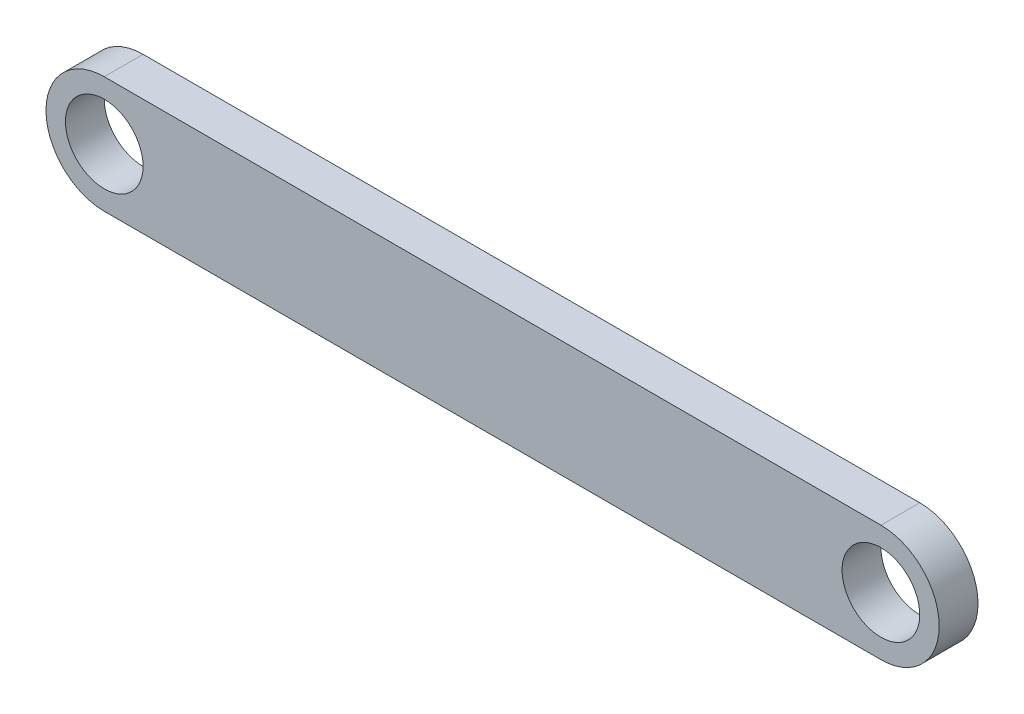
ISO-10303-21;
HEADER;
FILE_DESCRIPTION(('STEP AP214'),'2;1');
FILE_NAME('part.step','',(''),(''),'','','');
FILE_SCHEMA(('AUTOMOTIVE_DESIGN { 1 0 10303 214 1 1 1 1 }'));
ENDSEC;
DATA;
#1=APPLICATION_CONTEXT('core data for automotive mechanical design processes');
#2=APPLICATION_PROTOCOL_DEFINITION('international standard','automotive_design',2000,#1);
#3=PRODUCT_CONTEXT('',#1,'mechanical');
#4=PRODUCT('Part','Part','',(#3));
#5=PRODUCT_RELATED_PRODUCT_CATEGORY('part','',(#4));
#6=PRODUCT_DEFINITION_FORMATION('','',#4);
#7=PRODUCT_DEFINITION_CONTEXT('part definition',#1,'design');
#8=PRODUCT_DEFINITION('design','',#6,#7);
#9=PRODUCT_DEFINITION_SHAPE('','',#8);
#10=(LENGTH_UNIT() NAMED_UNIT(*) SI_UNIT(.MILLI.,.METRE.));
#11=(NAMED_UNIT(*) PLANE_ANGLE_UNIT() SI_UNIT($,.RADIAN.));
#12=(NAMED_UNIT(*) SI_UNIT($,.STERADIAN.) SOLID_ANGLE_UNIT());
#13=UNCERTAINTY_MEASURE_WITH_UNIT(LENGTH_MEASURE(1.E-05),#10,'distance_accuracy_value','');
#14=(GEOMETRIC_REPRESENTATION_CONTEXT(3) GLOBAL_UNCERTAINTY_ASSIGNED_CONTEXT((#13)) GLOBAL_UNIT_ASSIGNED_CONTEXT((#10,
#11,#12)) REPRESENTATION_CONTEXT('',''));
#15=CARTESIAN_POINT('',(0.,0.,0.));
#16=DIRECTION('',(0.,0.,1.));
#17=DIRECTION('',(1.,0.,0.));
#18=AXIS2_PLACEMENT_3D('',#15,#16,#17);
#19=CARTESIAN_POINT('',(0.,0.,5.));
#20=DIRECTION('',(0.,0.,1.));
#21=DIRECTION('',(1.,0.,0.));
#22=AXIS2_PLACEMENT_3D('',#19,#20,#21);
#23=PLANE('',#22);
#24=CARTESIAN_POINT('',(-200.,0.,5.));
#25=DIRECTION('',(0.,0.,1.));
#26=DIRECTION('',(1.,0.,0.));
#27=AXIS2_PLACEMENT_3D('',#24,#25,#26);
#28=CIRCLE('',#27,10.);
#29=CARTESIAN_POINT('',(-190.,0.,5.));
#30=VERTEX_POINT('',#29);
#31=EDGE_CURVE('E100',#30,#30,#28,.T.);
#32=ORIENTED_EDGE('',*,*,#31,.F.);
#33=EDGE_LOOP('',(#32));
#34=FACE_BOUND('',#33,.T.);
#35=CARTESIAN_POINT('',(0.,0.,5.));
#36=DIRECTION('',(0.,0.,1.));
#37=DIRECTION('',(1.,0.,0.));
#38=AXIS2_PLACEMENT_3D('',#35,#36,#37);
#39=CIRCLE('',#38,15.);
#40=CARTESIAN_POINT('',(0.,-15.,5.));
#41=VERTEX_POINT('',#40);
#42=CARTESIAN_POINT('',(0.,15.,5.));
#43=VERTEX_POINT('',#42);
#44=EDGE_CURVE('E85',#41,#43,#39,.T.);
#45=ORIENTED_EDGE('',*,*,#44,.T.);
#46=DIRECTION('',(-1.,0.,0.));
#47=VECTOR('',#46,1.);
#48=CARTESIAN_POINT('',(0.,15.,5.));
#49=LINE('',#48,#47);
#50=CARTESIAN_POINT('',(-200.,15.,5.));
#51=VERTEX_POINT('',#50);
#52=EDGE_CURVE('E80',#43,#51,#49,.T.);
#53=ORIENTED_EDGE('',*,*,#52,.T.);
#54=CARTESIAN_POINT('',(-200.,0.,5.));
#55=DIRECTION('',(0.,0.,1.));
#56=DIRECTION('',(1.,0.,0.));
#57=AXIS2_PLACEMENT_3D('',#54,#55,#56);
#58=CIRCLE('',#57,15.);
#59=CARTESIAN_POINT('',(-200.,-15.,5.));
#60=VERTEX_POINT('',#59);
#61=EDGE_CURVE('E83',#51,#60,#58,.T.);
#62=ORIENTED_EDGE('',*,*,#61,.T.);
#63=DIRECTION('',(1.,0.,0.));
#64=VECTOR('',#63,1.);
#65=CARTESIAN_POINT('',(0.,-15.,5.));
#66=LINE('',#65,#64);
#67=EDGE_CURVE('E50',#60,#41,#66,.T.);
#68=ORIENTED_EDGE('',*,*,#67,.T.);
#69=EDGE_LOOP('',(#45,#53,#62,#68));
#70=FACE_BOUND('',#69,.T.);
#71=CARTESIAN_POINT('',(0.,0.,5.));
#72=DIRECTION('',(0.,0.,1.));
#73=DIRECTION('',(1.,0.,0.));
#74=AXIS2_PLACEMENT_3D('',#71,#72,#73);
#75=CIRCLE('',#74,10.);
#76=CARTESIAN_POINT('',(10.,0.,5.));
#77=VERTEX_POINT('',#76);
#78=EDGE_CURVE('E115',#77,#77,#75,.T.);
#79=ORIENTED_EDGE('',*,*,#78,.F.);
#80=EDGE_LOOP('',(#79));
#81=FACE_BOUND('',#80,.T.);
#82=ADVANCED_FACE('F33',(#34,#70,#81),#23,.T.);
#83=CARTESIAN_POINT('',(0.,0.,-5.));
#84=DIRECTION('',(0.,0.,1.));
#85=DIRECTION('',(1.,0.,0.));
#86=AXIS2_PLACEMENT_3D('',#83,#84,#85);
#87=PLANE('',#86);
#88=CARTESIAN_POINT('',(0.,0.,-5.));
#89=DIRECTION('',(0.,0.,1.));
#90=DIRECTION('',(1.,0.,0.));
#91=AXIS2_PLACEMENT_3D('',#88,#89,#90);
#92=CIRCLE('',#91,15.);
#93=CARTESIAN_POINT('',(0.,-15.,-5.));
#94=VERTEX_POINT('',#93);
#95=CARTESIAN_POINT('',(0.,15.,-5.));
#96=VERTEX_POINT('',#95);
#97=EDGE_CURVE('E97',#94,#96,#92,.T.);
#98=ORIENTED_EDGE('',*,*,#97,.F.);
#99=DIRECTION('',(1.,0.,0.));
#100=VECTOR('',#99,1.);
#101=CARTESIAN_POINT('',(0.,-15.,-5.));
#102=LINE('',#101,#100);
#103=CARTESIAN_POINT('',(-200.,-15.,-5.));
#104=VERTEX_POINT('',#103);
#105=EDGE_CURVE('E73',#104,#94,#102,.T.);
#106=ORIENTED_EDGE('',*,*,#105,.F.);
#107=CARTESIAN_POINT('',(-200.,0.,-5.));
#108=DIRECTION('',(0.,0.,1.));
#109=DIRECTION('',(1.,0.,0.));
#110=AXIS2_PLACEMENT_3D('',#107,#108,#109);
#111=CIRCLE('',#110,15.);
#112=CARTESIAN_POINT('',(-200.,15.,-5.));
#113=VERTEX_POINT('',#112);
#114=EDGE_CURVE('E67',#113,#104,#111,.T.);
#115=ORIENTED_EDGE('',*,*,#114,.F.);
#116=DIRECTION('',(-1.,0.,0.));
#117=VECTOR('',#116,1.);
#118=CARTESIAN_POINT('',(0.,15.,-5.));
#119=LINE('',#118,#117);
#120=EDGE_CURVE('E89',#96,#113,#119,.T.);
#121=ORIENTED_EDGE('',*,*,#120,.F.);
#122=EDGE_LOOP('',(#98,#106,#115,#121));
#123=FACE_BOUND('',#122,.T.);
#124=CARTESIAN_POINT('',(-200.,0.,-5.));
#125=DIRECTION('',(0.,0.,1.));
#126=DIRECTION('',(1.,0.,0.));
#127=AXIS2_PLACEMENT_3D('',#124,#125,#126);
#128=CIRCLE('',#127,10.);
#129=CARTESIAN_POINT('',(-190.,0.,-5.));
#130=VERTEX_POINT('',#129);
#131=EDGE_CURVE('E112',#130,#130,#128,.T.);
#132=ORIENTED_EDGE('',*,*,#131,.T.);
#133=EDGE_LOOP('',(#132));
#134=FACE_BOUND('',#133,.T.);
#135=CARTESIAN_POINT('',(0.,0.,-5.));
#136=DIRECTION('',(0.,0.,1.));
#137=DIRECTION('',(1.,0.,0.));
#138=AXIS2_PLACEMENT_3D('',#135,#136,#137);
#139=CIRCLE('',#138,10.);
#140=CARTESIAN_POINT('',(10.,0.,-5.));
#141=VERTEX_POINT('',#140);
#142=EDGE_CURVE('E118',#141,#141,#139,.T.);
#143=ORIENTED_EDGE('',*,*,#142,.T.);
#144=EDGE_LOOP('',(#143));
#145=FACE_BOUND('',#144,.T.);
#146=ADVANCED_FACE('F108',(#123,#134,#145),#87,.F.);
#147=CARTESIAN_POINT('',(0.,0.,5.));
#148=DIRECTION('',(0.,0.,-1.));
#149=DIRECTION('',(-1.,0.,0.));
#150=AXIS2_PLACEMENT_3D('',#147,#148,#149);
#151=CYLINDRICAL_SURFACE('',#150,15.);
#152=ORIENTED_EDGE('',*,*,#97,.T.);
#153=DIRECTION('',(0.,0.,-1.));
#154=VECTOR('',#153,1.);
#155=CARTESIAN_POINT('',(0.,15.,5.));
#156=LINE('',#155,#154);
#157=EDGE_CURVE('E11',#43,#96,#156,.T.);
#158=ORIENTED_EDGE('',*,*,#157,.F.);
#159=ORIENTED_EDGE('',*,*,#44,.F.);
#160=DIRECTION('',(0.,0.,-1.));
#161=VECTOR('',#160,1.);
#162=CARTESIAN_POINT('',(0.,-15.,5.));
#163=LINE('',#162,#161);
#164=EDGE_CURVE('E93',#41,#94,#163,.T.);
#165=ORIENTED_EDGE('',*,*,#164,.T.);
#166=EDGE_LOOP('',(#152,#158,#159,#165));
#167=FACE_BOUND('',#166,.T.);
#168=ADVANCED_FACE('F35',(#167),#151,.T.);
#169=CARTESIAN_POINT('',(0.,15.,5.));
#170=DIRECTION('',(0.,-1.,0.));
#171=DIRECTION('',(1.,0.,0.));
#172=AXIS2_PLACEMENT_3D('',#169,#170,#171);
#173=PLANE('',#172);
#174=ORIENTED_EDGE('',*,*,#120,.T.);
#175=DIRECTION('',(0.,0.,-1.));
#176=VECTOR('',#175,1.);
#177=CARTESIAN_POINT('',(-200.,15.,5.));
#178=LINE('',#177,#176);
#179=EDGE_CURVE('E42',#51,#113,#178,.T.);
#180=ORIENTED_EDGE('',*,*,#179,.F.);
#181=ORIENTED_EDGE('',*,*,#52,.F.);
#182=ORIENTED_EDGE('',*,*,#157,.T.);
#183=EDGE_LOOP('',(#174,#180,#181,#182));
#184=FACE_BOUND('',#183,.T.);
#185=ADVANCED_FACE('F88',(#184),#173,.F.);
#186=CARTESIAN_POINT('',(-200.,0.,5.));
#187=DIRECTION('',(0.,0.,-1.));
#188=DIRECTION('',(-1.,0.,0.));
#189=AXIS2_PLACEMENT_3D('',#186,#187,#188);
#190=CYLINDRICAL_SURFACE('',#189,15.);
#191=ORIENTED_EDGE('',*,*,#114,.T.);
#192=DIRECTION('',(0.,0.,-1.));
#193=VECTOR('',#192,1.);
#194=CARTESIAN_POINT('',(-200.,-15.,5.));
#195=LINE('',#194,#193);
#196=EDGE_CURVE('E90',#60,#104,#195,.T.);
#197=ORIENTED_EDGE('',*,*,#196,.F.);
#198=ORIENTED_EDGE('',*,*,#61,.F.);
#199=ORIENTED_EDGE('',*,*,#179,.T.);
#200=EDGE_LOOP('',(#191,#197,#198,#199));
#201=FACE_BOUND('',#200,.T.);
#202=ADVANCED_FACE('F91',(#201),#190,.T.);
#203=CARTESIAN_POINT('',(0.,-15.,5.));
#204=DIRECTION('',(0.,1.,0.));
#205=DIRECTION('',(-1.,0.,0.));
#206=AXIS2_PLACEMENT_3D('',#203,#204,#205);
#207=PLANE('',#206);
#208=ORIENTED_EDGE('',*,*,#105,.T.);
#209=ORIENTED_EDGE('',*,*,#164,.F.);
#210=ORIENTED_EDGE('',*,*,#67,.F.);
#211=ORIENTED_EDGE('',*,*,#196,.T.);
#212=EDGE_LOOP('',(#208,#209,#210,#211));
#213=FACE_BOUND('',#212,.T.);
#214=ADVANCED_FACE('F105',(#213),#207,.F.);
#215=CARTESIAN_POINT('',(-200.,0.,5.));
#216=DIRECTION('',(0.,0.,-1.));
#217=DIRECTION('',(-1.,0.,0.));
#218=AXIS2_PLACEMENT_3D('',#215,#216,#217);
#219=CYLINDRICAL_SURFACE('',#218,10.);
#220=ORIENTED_EDGE('',*,*,#31,.T.);
#221=EDGE_LOOP('',(#220));
#222=FACE_BOUND('',#221,.T.);
#223=ORIENTED_EDGE('',*,*,#131,.F.);
#224=EDGE_LOOP('',(#223));
#225=FACE_BOUND('',#224,.T.);
#226=ADVANCED_FACE('F135',(#222,#225),#219,.F.);
#227=CARTESIAN_POINT('',(0.,0.,5.));
#228=DIRECTION('',(0.,0.,-1.));
#229=DIRECTION('',(-1.,0.,0.));
#230=AXIS2_PLACEMENT_3D('',#227,#228,#229);
#231=CYLINDRICAL_SURFACE('',#230,10.);
#232=ORIENTED_EDGE('',*,*,#78,.T.);
#233=EDGE_LOOP('',(#232));
#234=FACE_BOUND('',#233,.T.);
#235=ORIENTED_EDGE('',*,*,#142,.F.);
#236=EDGE_LOOP('',(#235));
#237=FACE_BOUND('',#236,.T.);
#238=ADVANCED_FACE('F124',(#234,#237),#231,.F.);
#239=CLOSED_SHELL('',(#82,#146,#168,#185,#202,#214,#226,#238));
#240=MANIFOLD_SOLID_BREP('B2',#239);
#241=ADVANCED_BREP_SHAPE_REPRESENTATION('',(#18,#240),#14);
#242=SHAPE_DEFINITION_REPRESENTATION(#9,#241);
ENDSEC;
END-ISO-10303-21;
